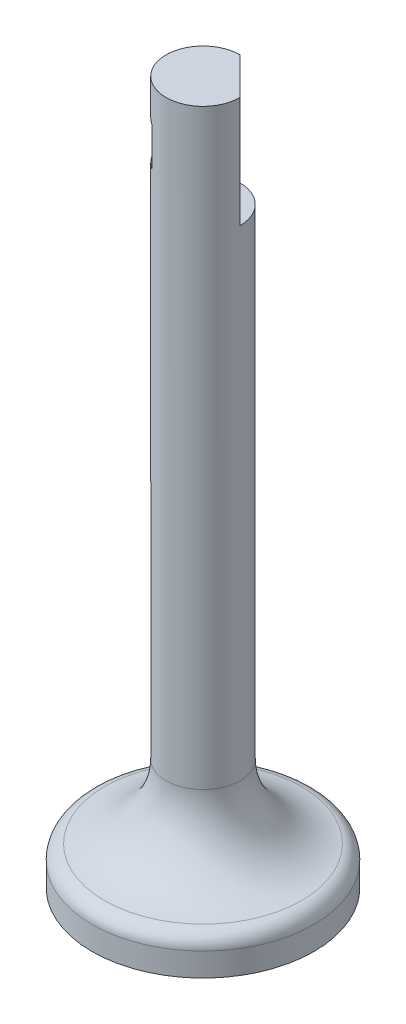
ISO-10303-21;
HEADER;
FILE_DESCRIPTION(('STEP AP214'),'2;1');
FILE_NAME('part.step','',(''),(''),'','','');
FILE_SCHEMA(('AUTOMOTIVE_DESIGN { 1 0 10303 214 1 1 1 1 }'));
ENDSEC;
DATA;
#1=APPLICATION_CONTEXT('core data for automotive mechanical design processes');
#2=APPLICATION_PROTOCOL_DEFINITION('international standard','automotive_design',2000,#1);
#3=PRODUCT_CONTEXT('',#1,'mechanical');
#4=PRODUCT('Part','Part','',(#3));
#5=PRODUCT_RELATED_PRODUCT_CATEGORY('part','',(#4));
#6=PRODUCT_DEFINITION_FORMATION('','',#4);
#7=PRODUCT_DEFINITION_CONTEXT('part definition',#1,'design');
#8=PRODUCT_DEFINITION('design','',#6,#7);
#9=PRODUCT_DEFINITION_SHAPE('','',#8);
#10=(LENGTH_UNIT() NAMED_UNIT(*) SI_UNIT(.MILLI.,.METRE.));
#11=(NAMED_UNIT(*) PLANE_ANGLE_UNIT() SI_UNIT($,.RADIAN.));
#12=(NAMED_UNIT(*) SI_UNIT($,.STERADIAN.) SOLID_ANGLE_UNIT());
#13=UNCERTAINTY_MEASURE_WITH_UNIT(LENGTH_MEASURE(1.E-05),#10,'distance_accuracy_value','');
#14=(GEOMETRIC_REPRESENTATION_CONTEXT(3) GLOBAL_UNCERTAINTY_ASSIGNED_CONTEXT((#13)) GLOBAL_UNIT_ASSIGNED_CONTEXT((#10,
#11,#12)) REPRESENTATION_CONTEXT('',''));
#15=CARTESIAN_POINT('',(0.,0.,0.));
#16=DIRECTION('',(0.,0.,1.));
#17=DIRECTION('',(1.,0.,0.));
#18=AXIS2_PLACEMENT_3D('',#15,#16,#17);
#19=CARTESIAN_POINT('',(0.,0.,0.));
#20=DIRECTION('',(0.,1.,0.));
#21=DIRECTION('',(0.,0.,1.));
#22=AXIS2_PLACEMENT_3D('',#19,#20,#21);
#23=PLANE('',#22);
#24=CARTESIAN_POINT('',(0.,0.,0.));
#25=DIRECTION('',(0.,-1.,0.));
#26=DIRECTION('',(0.,0.,-1.));
#27=AXIS2_PLACEMENT_3D('',#24,#25,#26);
#28=CIRCLE('',#27,13.5);
#29=CARTESIAN_POINT('',(0.,0.,-13.5));
#30=VERTEX_POINT('',#29);
#31=EDGE_CURVE('E206',#30,#30,#28,.T.);
#32=ORIENTED_EDGE('',*,*,#31,.F.);
#33=EDGE_LOOP('',(#32));
#34=FACE_BOUND('',#33,.T.);
#35=CARTESIAN_POINT('',(0.,0.,0.));
#36=DIRECTION('',(0.,1.,0.));
#37=DIRECTION('',(0.,0.,1.));
#38=AXIS2_PLACEMENT_3D('',#35,#36,#37);
#39=CIRCLE('',#38,15.);
#40=CARTESIAN_POINT('',(0.,0.,15.));
#41=VERTEX_POINT('',#40);
#42=EDGE_CURVE('E370',#41,#41,#39,.T.);
#43=ORIENTED_EDGE('',*,*,#42,.F.);
#44=EDGE_LOOP('',(#43));
#45=FACE_BOUND('',#44,.T.);
#46=ADVANCED_FACE('F34',(#34,#45),#23,.F.);
#47=CARTESIAN_POINT('',(0.,5.,0.));
#48=DIRECTION('',(0.,-1.,0.));
#49=DIRECTION('',(0.,0.,-1.));
#50=AXIS2_PLACEMENT_3D('',#47,#48,#49);
#51=CYLINDRICAL_SURFACE('',#50,15.);
#52=CARTESIAN_POINT('',(0.,3.16784043380077,0.));
#53=DIRECTION('',(0.,-1.,0.));
#54=DIRECTION('',(0.,0.,-1.));
#55=AXIS2_PLACEMENT_3D('',#52,#53,#54);
#56=CIRCLE('',#55,15.);
#57=CARTESIAN_POINT('',(0.,3.16784043380077,-15.));
#58=VERTEX_POINT('',#57);
#59=EDGE_CURVE('E11',#58,#58,#56,.T.);
#60=ORIENTED_EDGE('',*,*,#59,.T.);
#61=EDGE_LOOP('',(#60));
#62=FACE_BOUND('',#61,.T.);
#63=ORIENTED_EDGE('',*,*,#42,.T.);
#64=EDGE_LOOP('',(#63));
#65=FACE_BOUND('',#64,.T.);
#66=ADVANCED_FACE('F394',(#62,#65),#51,.T.);
#67=CARTESIAN_POINT('',(0.,95.,0.));
#68=DIRECTION('',(0.,-1.,0.));
#69=DIRECTION('',(0.,0.,-1.));
#70=AXIS2_PLACEMENT_3D('',#67,#68,#69);
#71=CYLINDRICAL_SURFACE('',#70,5.);
#72=CARTESIAN_POINT('',(0.,15.,0.));
#73=DIRECTION('',(0.,1.,0.));
#74=DIRECTION('',(0.,0.,1.));
#75=AXIS2_PLACEMENT_3D('',#72,#73,#74);
#76=CIRCLE('',#75,5.);
#77=CARTESIAN_POINT('',(0.,15.,5.));
#78=VERTEX_POINT('',#77);
#79=EDGE_CURVE('E373',#78,#78,#76,.T.);
#80=ORIENTED_EDGE('',*,*,#79,.T.);
#81=EDGE_LOOP('',(#80));
#82=FACE_BOUND('',#81,.T.);
#83=CARTESIAN_POINT('',(0.,90.1,0.));
#84=DIRECTION('',(0.,1.,0.));
#85=DIRECTION('',(0.,0.,1.));
#86=AXIS2_PLACEMENT_3D('',#83,#84,#85);
#87=CIRCLE('',#86,5.);
#88=CARTESIAN_POINT('',(-4.1712083963243,90.1,2.7569948339512));
#89=VERTEX_POINT('',#88);
#90=CARTESIAN_POINT('',(-2.75699483395121,90.1,4.1712083963243));
#91=VERTEX_POINT('',#90);
#92=EDGE_CURVE('E349',#89,#91,#87,.T.);
#93=ORIENTED_EDGE('',*,*,#92,.T.);
#94=DIRECTION('',(0.,-1.,0.));
#95=VECTOR('',#94,1.);
#96=CARTESIAN_POINT('',(-2.75699483395121,95.,4.1712083963243));
#97=LINE('',#96,#95);
#98=CARTESIAN_POINT('',(-2.75699483395121,84.9,4.1712083963243));
#99=VERTEX_POINT('',#98);
#100=EDGE_CURVE('E352',#91,#99,#97,.T.);
#101=ORIENTED_EDGE('',*,*,#100,.T.);
#102=CARTESIAN_POINT('',(0.,84.9,0.));
#103=DIRECTION('',(0.,-1.,0.));
#104=DIRECTION('',(0.,0.,-1.));
#105=AXIS2_PLACEMENT_3D('',#102,#103,#104);
#106=CIRCLE('',#105,5.);
#107=CARTESIAN_POINT('',(-4.1712083963243,84.9,2.75699483395121));
#108=VERTEX_POINT('',#107);
#109=EDGE_CURVE('E337',#99,#108,#106,.T.);
#110=ORIENTED_EDGE('',*,*,#109,.T.);
#111=DIRECTION('',(0.,-1.,0.));
#112=VECTOR('',#111,1.);
#113=CARTESIAN_POINT('',(-4.1712083963243,95.,2.75699483395121));
#114=LINE('',#113,#112);
#115=EDGE_CURVE('E346',#108,#89,#114,.F.);
#116=ORIENTED_EDGE('',*,*,#115,.T.);
#117=EDGE_LOOP('',(#93,#101,#110,#116));
#118=FACE_BOUND('',#117,.T.);
#119=CARTESIAN_POINT('',(0.,95.,0.));
#120=DIRECTION('',(0.,1.,0.));
#121=DIRECTION('',(0.,0.,1.));
#122=AXIS2_PLACEMENT_3D('',#119,#120,#121);
#123=CIRCLE('',#122,5.);
#124=CARTESIAN_POINT('',(0.,95.,-5.));
#125=VERTEX_POINT('',#124);
#126=CARTESIAN_POINT('',(5.,95.,0.));
#127=VERTEX_POINT('',#126);
#128=EDGE_CURVE('E366',#125,#127,#123,.T.);
#129=ORIENTED_EDGE('',*,*,#128,.F.);
#130=DIRECTION('',(0.,1.,0.));
#131=VECTOR('',#130,1.);
#132=CARTESIAN_POINT('',(0.,80.,-5.));
#133=LINE('',#132,#131);
#134=CARTESIAN_POINT('',(0.,80.,-5.));
#135=VERTEX_POINT('',#134);
#136=EDGE_CURVE('E361',#135,#125,#133,.T.);
#137=ORIENTED_EDGE('',*,*,#136,.F.);
#138=CARTESIAN_POINT('',(0.,80.,0.));
#139=DIRECTION('',(0.,1.,0.));
#140=DIRECTION('',(0.,0.,-1.));
#141=AXIS2_PLACEMENT_3D('',#138,#139,#140);
#142=CIRCLE('',#141,5.00000000000001);
#143=CARTESIAN_POINT('',(5.,80.,0.));
#144=VERTEX_POINT('',#143);
#145=EDGE_CURVE('E356',#144,#135,#142,.T.);
#146=ORIENTED_EDGE('',*,*,#145,.F.);
#147=DIRECTION('',(0.,1.,0.));
#148=VECTOR('',#147,1.);
#149=CARTESIAN_POINT('',(5.,80.,0.));
#150=LINE('',#149,#148);
#151=EDGE_CURVE('E363',#144,#127,#150,.T.);
#152=ORIENTED_EDGE('',*,*,#151,.T.);
#153=EDGE_LOOP('',(#129,#137,#146,#152));
#154=FACE_BOUND('',#153,.T.);
#155=ADVANCED_FACE('F401',(#82,#118,#154),#71,.T.);
#156=CARTESIAN_POINT('',(0.,95.,0.));
#157=DIRECTION('',(0.,1.,0.));
#158=DIRECTION('',(0.,0.,1.));
#159=AXIS2_PLACEMENT_3D('',#156,#157,#158);
#160=PLANE('',#159);
#161=DIRECTION('',(0.707106781186548,0.,0.707106781186548));
#162=VECTOR('',#161,1.);
#163=CARTESIAN_POINT('',(0.,95.,-5.));
#164=LINE('',#163,#162);
#165=EDGE_CURVE('E355',#125,#127,#164,.T.);
#166=ORIENTED_EDGE('',*,*,#165,.F.);
#167=ORIENTED_EDGE('',*,*,#128,.T.);
#168=EDGE_LOOP('',(#166,#167));
#169=FACE_BOUND('',#168,.T.);
#170=ADVANCED_FACE('F503',(#169),#160,.T.);
#171=CARTESIAN_POINT('',(0.,80.,-5.));
#172=DIRECTION('',(-0.707106781186547,0.,0.707106781186547));
#173=DIRECTION('',(0.707106781186548,0.,0.707106781186548));
#174=AXIS2_PLACEMENT_3D('',#171,#172,#173);
#175=PLANE('',#174);
#176=DIRECTION('',(-0.707106781186547,0.,-0.707106781186548));
#177=VECTOR('',#176,1.);
#178=CARTESIAN_POINT('',(1.79289321881345,84.9,-3.20710678118655));
#179=LINE('',#178,#177);
#180=CARTESIAN_POINT('',(3.20710678118655,84.9,-1.79289321881345));
#181=VERTEX_POINT('',#180);
#182=CARTESIAN_POINT('',(1.79289321881345,84.9,-3.20710678118655));
#183=VERTEX_POINT('',#182);
#184=EDGE_CURVE('E325',#181,#183,#179,.T.);
#185=ORIENTED_EDGE('',*,*,#184,.F.);
#186=DIRECTION('',(0.,-1.,0.));
#187=VECTOR('',#186,1.);
#188=CARTESIAN_POINT('',(3.20710678118655,90.1,-1.79289321881345));
#189=LINE('',#188,#187);
#190=CARTESIAN_POINT('',(3.20710678118655,90.1,-1.79289321881345));
#191=VERTEX_POINT('',#190);
#192=EDGE_CURVE('E323',#191,#181,#189,.T.);
#193=ORIENTED_EDGE('',*,*,#192,.F.);
#194=DIRECTION('',(0.707106781186547,0.,0.707106781186548));
#195=VECTOR('',#194,1.);
#196=CARTESIAN_POINT('',(1.79289321881345,90.1,-3.20710678118655));
#197=LINE('',#196,#195);
#198=CARTESIAN_POINT('',(1.79289321881345,90.1,-3.20710678118655));
#199=VERTEX_POINT('',#198);
#200=EDGE_CURVE('E331',#199,#191,#197,.T.);
#201=ORIENTED_EDGE('',*,*,#200,.F.);
#202=DIRECTION('',(0.,1.,0.));
#203=VECTOR('',#202,1.);
#204=CARTESIAN_POINT('',(1.79289321881345,90.1,-3.20710678118655));
#205=LINE('',#204,#203);
#206=EDGE_CURVE('E328',#183,#199,#205,.T.);
#207=ORIENTED_EDGE('',*,*,#206,.F.);
#208=EDGE_LOOP('',(#185,#193,#201,#207));
#209=FACE_BOUND('',#208,.T.);
#210=ORIENTED_EDGE('',*,*,#165,.T.);
#211=ORIENTED_EDGE('',*,*,#151,.F.);
#212=DIRECTION('',(0.707106781186548,0.,0.707106781186548));
#213=VECTOR('',#212,1.);
#214=CARTESIAN_POINT('',(0.,80.,-5.));
#215=LINE('',#214,#213);
#216=EDGE_CURVE('E358',#135,#144,#215,.T.);
#217=ORIENTED_EDGE('',*,*,#216,.F.);
#218=ORIENTED_EDGE('',*,*,#136,.T.);
#219=EDGE_LOOP('',(#210,#211,#217,#218));
#220=FACE_BOUND('',#219,.T.);
#221=ADVANCED_FACE('F499',(#209,#220),#175,.F.);
#222=CARTESIAN_POINT('',(0.,80.,0.));
#223=DIRECTION('',(0.,-1.,0.));
#224=DIRECTION('',(0.,0.,-1.));
#225=AXIS2_PLACEMENT_3D('',#222,#223,#224);
#226=PLANE('',#225);
#227=ORIENTED_EDGE('',*,*,#145,.T.);
#228=ORIENTED_EDGE('',*,*,#216,.T.);
#229=EDGE_LOOP('',(#227,#228));
#230=FACE_BOUND('',#229,.T.);
#231=ADVANCED_FACE('F495',(#230),#226,.F.);
#232=CARTESIAN_POINT('',(-14.2928932188135,90.1,15.7071067811865));
#233=DIRECTION('',(0.707106781186548,0.,0.707106781186548));
#234=DIRECTION('',(0.707106781186548,0.,-0.707106781186547));
#235=AXIS2_PLACEMENT_3D('',#232,#233,#234);
#236=PLANE('',#235);
#237=DIRECTION('',(0.707106781186548,0.,-0.707106781186548));
#238=VECTOR('',#237,1.);
#239=CARTESIAN_POINT('',(-14.2928932188135,90.1,15.7071067811865));
#240=LINE('',#239,#238);
#241=EDGE_CURVE('E335',#91,#191,#240,.T.);
#242=ORIENTED_EDGE('',*,*,#241,.T.);
#243=ORIENTED_EDGE('',*,*,#192,.T.);
#244=DIRECTION('',(0.707106781186548,0.,-0.707106781186548));
#245=VECTOR('',#244,1.);
#246=CARTESIAN_POINT('',(-14.2928932188135,84.9,15.7071067811865));
#247=LINE('',#246,#245);
#248=EDGE_CURVE('E334',#99,#181,#247,.T.);
#249=ORIENTED_EDGE('',*,*,#248,.F.);
#250=ORIENTED_EDGE('',*,*,#100,.F.);
#251=EDGE_LOOP('',(#242,#243,#249,#250));
#252=FACE_BOUND('',#251,.T.);
#253=ADVANCED_FACE('F485',(#252),#236,.F.);
#254=CARTESIAN_POINT('',(-15.7071067811866,90.1,14.2928932188135));
#255=DIRECTION('',(0.,1.,0.));
#256=DIRECTION('',(0.,0.,1.));
#257=AXIS2_PLACEMENT_3D('',#254,#255,#256);
#258=PLANE('',#257);
#259=DIRECTION('',(0.707106781186548,0.,-0.707106781186548));
#260=VECTOR('',#259,1.);
#261=CARTESIAN_POINT('',(-15.7071067811866,90.1,14.2928932188135));
#262=LINE('',#261,#260);
#263=EDGE_CURVE('E338',#89,#199,#262,.T.);
#264=ORIENTED_EDGE('',*,*,#263,.T.);
#265=ORIENTED_EDGE('',*,*,#200,.T.);
#266=ORIENTED_EDGE('',*,*,#241,.F.);
#267=ORIENTED_EDGE('',*,*,#92,.F.);
#268=EDGE_LOOP('',(#264,#265,#266,#267));
#269=FACE_BOUND('',#268,.T.);
#270=ADVANCED_FACE('F481',(#269),#258,.F.);
#271=CARTESIAN_POINT('',(-15.7071067811866,90.1,14.2928932188135));
#272=DIRECTION('',(-0.707106781186548,0.,-0.707106781186548));
#273=DIRECTION('',(-0.707106781186548,0.,0.707106781186547));
#274=AXIS2_PLACEMENT_3D('',#271,#272,#273);
#275=PLANE('',#274);
#276=DIRECTION('',(0.707106781186548,0.,-0.707106781186548));
#277=VECTOR('',#276,1.);
#278=CARTESIAN_POINT('',(-15.7071067811866,84.9,14.2928932188135));
#279=LINE('',#278,#277);
#280=EDGE_CURVE('E340',#108,#183,#279,.T.);
#281=ORIENTED_EDGE('',*,*,#280,.T.);
#282=ORIENTED_EDGE('',*,*,#206,.T.);
#283=ORIENTED_EDGE('',*,*,#263,.F.);
#284=ORIENTED_EDGE('',*,*,#115,.F.);
#285=EDGE_LOOP('',(#281,#282,#283,#284));
#286=FACE_BOUND('',#285,.T.);
#287=ADVANCED_FACE('F484',(#286),#275,.F.);
#288=CARTESIAN_POINT('',(-15.7071067811866,84.9,14.2928932188135));
#289=DIRECTION('',(0.,-1.,0.));
#290=DIRECTION('',(0.,0.,-1.));
#291=AXIS2_PLACEMENT_3D('',#288,#289,#290);
#292=PLANE('',#291);
#293=ORIENTED_EDGE('',*,*,#248,.T.);
#294=ORIENTED_EDGE('',*,*,#184,.T.);
#295=ORIENTED_EDGE('',*,*,#280,.F.);
#296=ORIENTED_EDGE('',*,*,#109,.F.);
#297=EDGE_LOOP('',(#293,#294,#295,#296));
#298=FACE_BOUND('',#297,.T.);
#299=ADVANCED_FACE('F391',(#298),#292,.F.);
#300=CARTESIAN_POINT('',(0.,15.,0.));
#301=DIRECTION('',(0.,1.,0.));
#302=DIRECTION('',(0.,0.,1.));
#303=AXIS2_PLACEMENT_3D('',#300,#301,#302);
#304=TOROIDAL_SURFACE('',#303,15.,10.);
#305=CARTESIAN_POINT('',(0.,5.13986702816722,0.));
#306=DIRECTION('',(0.,1.,0.));
#307=DIRECTION('',(0.,0.,1.));
#308=AXIS2_PLACEMENT_3D('',#305,#306,#307);
#309=CIRCLE('',#308,13.3333333333333);
#310=CARTESIAN_POINT('',(0.,5.13986702816722,13.3333333333333));
#311=VERTEX_POINT('',#310);
#312=EDGE_CURVE('E42',#311,#311,#309,.T.);
#313=ORIENTED_EDGE('',*,*,#312,.T.);
#314=EDGE_LOOP('',(#313));
#315=FACE_BOUND('',#314,.T.);
#316=ORIENTED_EDGE('',*,*,#79,.F.);
#317=EDGE_LOOP('',(#316));
#318=FACE_BOUND('',#317,.T.);
#319=ADVANCED_FACE('F378',(#315,#318),#304,.F.);
#320=CARTESIAN_POINT('',(0.,3.16784043380077,0.));
#321=DIRECTION('',(0.,-1.,0.));
#322=DIRECTION('',(0.,0.,-1.));
#323=AXIS2_PLACEMENT_3D('',#320,#321,#322);
#324=TOROIDAL_SURFACE('',#323,13.,2.);
#325=ORIENTED_EDGE('',*,*,#59,.F.);
#326=EDGE_LOOP('',(#325));
#327=FACE_BOUND('',#326,.T.);
#328=ORIENTED_EDGE('',*,*,#312,.F.);
#329=EDGE_LOOP('',(#328));
#330=FACE_BOUND('',#329,.T.);
#331=ADVANCED_FACE('F36',(#327,#330),#324,.T.);
#332=CARTESIAN_POINT('',(0.,1.,0.));
#333=DIRECTION('',(0.,-1.,0.));
#334=DIRECTION('',(0.,0.,-1.));
#335=AXIS2_PLACEMENT_3D('',#332,#333,#334);
#336=CYLINDRICAL_SURFACE('',#335,13.5);
#337=CARTESIAN_POINT('',(0.,1.,0.));
#338=DIRECTION('',(0.,-1.,0.));
#339=DIRECTION('',(0.,0.,-1.));
#340=AXIS2_PLACEMENT_3D('',#337,#338,#339);
#341=CIRCLE('',#340,13.5);
#342=CARTESIAN_POINT('',(0.,1.,-13.5));
#343=VERTEX_POINT('',#342);
#344=EDGE_CURVE('E421',#343,#343,#341,.T.);
#345=ORIENTED_EDGE('',*,*,#344,.F.);
#346=EDGE_LOOP('',(#345));
#347=FACE_BOUND('',#346,.T.);
#348=ORIENTED_EDGE('',*,*,#31,.T.);
#349=EDGE_LOOP('',(#348));
#350=FACE_BOUND('',#349,.T.);
#351=ADVANCED_FACE('F382',(#347,#350),#336,.F.);
#352=CARTESIAN_POINT('',(0.,1.,0.));
#353=DIRECTION('',(0.,-1.,0.));
#354=DIRECTION('',(0.,0.,-1.));
#355=AXIS2_PLACEMENT_3D('',#352,#353,#354);
#356=PLANE('',#355);
#357=CARTESIAN_POINT('',(0.,1.,0.));
#358=DIRECTION('',(0.,-1.,0.));
#359=DIRECTION('',(0.,0.,-1.));
#360=AXIS2_PLACEMENT_3D('',#357,#358,#359);
#361=CIRCLE('',#360,11.5);
#362=CARTESIAN_POINT('',(0.,1.,-11.5));
#363=VERTEX_POINT('',#362);
#364=EDGE_CURVE('E722',#363,#363,#361,.T.);
#365=ORIENTED_EDGE('',*,*,#364,.F.);
#366=EDGE_LOOP('',(#365));
#367=FACE_BOUND('',#366,.T.);
#368=ORIENTED_EDGE('',*,*,#344,.T.);
#369=EDGE_LOOP('',(#368));
#370=FACE_BOUND('',#369,.T.);
#371=ADVANCED_FACE('F388',(#367,#370),#356,.T.);
#372=CARTESIAN_POINT('',(0.,1.,0.));
#373=DIRECTION('',(0.,-1.,0.));
#374=DIRECTION('',(0.,0.,-1.));
#375=AXIS2_PLACEMENT_3D('',#372,#373,#374);
#376=CYLINDRICAL_SURFACE('',#375,11.5);
#377=ORIENTED_EDGE('',*,*,#364,.T.);
#378=EDGE_LOOP('',(#377));
#379=FACE_BOUND('',#378,.T.);
#380=CARTESIAN_POINT('',(0.,0.,0.));
#381=DIRECTION('',(0.,-1.,0.));
#382=DIRECTION('',(0.,0.,-1.));
#383=AXIS2_PLACEMENT_3D('',#380,#381,#382);
#384=CIRCLE('',#383,11.5);
#385=CARTESIAN_POINT('',(0.,0.,-11.5));
#386=VERTEX_POINT('',#385);
#387=EDGE_CURVE('E726',#386,#386,#384,.T.);
#388=ORIENTED_EDGE('',*,*,#387,.F.);
#389=EDGE_LOOP('',(#388));
#390=FACE_BOUND('',#389,.T.);
#391=ADVANCED_FACE('F411',(#379,#390),#376,.T.);
#392=DIRECTION('',(-0.707106781186547,0.,0.707106781186547));
#393=VECTOR('',#392,1.);
#394=CARTESIAN_POINT('',(6.7283189038852,0.,-1.64387003302747));
#395=LINE('',#394,#393);
#396=CARTESIAN_POINT('',(6.7283189038852,0.,-1.64387003302747));
#397=VERTEX_POINT('',#396);
#398=CARTESIAN_POINT('',(2.73793428850058,0.,2.34651458235714));
#399=VERTEX_POINT('',#398);
#400=EDGE_CURVE('E418',#397,#399,#395,.T.);
#401=ORIENTED_EDGE('',*,*,#400,.T.);
#402=DIRECTION('',(-0.707106781186547,0.,-0.707106781186547));
#403=VECTOR('',#402,1.);
#404=CARTESIAN_POINT('',(2.73793428850058,0.,2.34651458235714));
#405=LINE('',#404,#403);
#406=CARTESIAN_POINT('',(-0.1466810961148,0.,-0.538100802258242));
#407=VERTEX_POINT('',#406);
#408=EDGE_CURVE('E179',#399,#407,#405,.T.);
#409=ORIENTED_EDGE('',*,*,#408,.T.);
#410=CARTESIAN_POINT('',(-0.1466810961148,0.,-0.538100802258242));
#411=CARTESIAN_POINT('',(-0.260313381040353,0.,-0.654281270047645));
#412=CARTESIAN_POINT('',(-0.479959167902267,0.,-0.87885257284515));
#413=CARTESIAN_POINT('',(-0.773260090550031,0.,-1.22442088889786));
#414=CARTESIAN_POINT('',(-1.02708125579143,0.,-1.55905385316477));
#415=CARTESIAN_POINT('',(-1.23492163685,0.,-1.88554987427232));
#416=CARTESIAN_POINT('',(-1.40503337765702,0.,-2.20151633315848));
#417=CARTESIAN_POINT('',(-1.53200552415492,0.,-2.50925923637634));
#418=CARTESIAN_POINT('',(-1.61338180986301,0.,-2.80986865707557));
#419=CARTESIAN_POINT('',(-1.65318334289346,0.,-3.10201852880461));
#420=CARTESIAN_POINT('',(-1.6518259708436,0.,-3.38626179466907));
#421=CARTESIAN_POINT('',(-1.62027035623891,0.,-3.66383710708299));
#422=CARTESIAN_POINT('',(-1.55486640136559,0.,-3.93576491461758));
#423=CARTESIAN_POINT('',(-1.45863640347979,0.,-4.20262408613098));
#424=CARTESIAN_POINT('',(-1.32809101858191,0.,-4.46395990649645));
#425=CARTESIAN_POINT('',(-1.16776543244624,0.,-4.7217632457264));
#426=CARTESIAN_POINT('',(-0.97110420860823,0.,-4.97121055164106));
#427=CARTESIAN_POINT('',(-0.822117923174768,0.,-5.12794053084351));
#428=CARTESIAN_POINT('',(-0.746040070473775,0.,-5.20797259713004));
#429=B_SPLINE_CURVE_WITH_KNOTS('',3,(#410,#411,#412,#413,#414,#415,#416,#417,#418,#419,#420,
#421,#422,#423,#424,#425,#426,#427,#428),.UNSPECIFIED.,.F.,.F.,(4,1,1,1,1,1,1,1,1,1,1,1,1,1,1,1,
4),(0.,0.0903689686180256,0.174678906025784,0.251933054033876,0.32380936433784,
0.389737713133366,0.451314912353861,0.508543364637113,0.562500321348931,0.614795436923639,
0.666246368663659,0.71755984108315,0.770006678726507,0.823691330936171,0.879753959757821,
0.938597968861317,1.),.UNSPECIFIED.);
#430=CARTESIAN_POINT('',(-0.746040070473775,0.,-5.20797259713004));
#431=VERTEX_POINT('',#430);
#432=EDGE_CURVE('E57',#407,#431,#429,.T.);
#433=ORIENTED_EDGE('',*,*,#432,.T.);
#434=CARTESIAN_POINT('',(-0.746040070473775,0.,-5.20797259713004));
#435=CARTESIAN_POINT('',(-0.629335699997128,0.,-5.31630256621493));
#436=CARTESIAN_POINT('',(-0.402138795389844,0.,-5.52719641322143));
#437=CARTESIAN_POINT('',(-0.0192591634673007,0.,-5.7762508173502));
#438=CARTESIAN_POINT('',(0.382841414157794,0.,-5.95689026275365));
#439=CARTESIAN_POINT('',(0.800723527824096,0.,-6.06039970585505));
#440=CARTESIAN_POINT('',(1.2196986621587,0.,-6.10280381107347));
#441=CARTESIAN_POINT('',(1.63012575070082,0.,-6.06432865019671));
#442=CARTESIAN_POINT('',(2.02839093583842,0.,-5.96488044824835));
#443=CARTESIAN_POINT('',(2.27191715689669,0.,-5.84105954873388));
#444=CARTESIAN_POINT('',(2.39498557055187,0.,-5.77848541764286));
#445=B_SPLINE_CURVE_WITH_KNOTS('',3,(#434,#435,#436,#437,#438,#439,#440,#441,#442,#443,#444),
.UNSPECIFIED.,.F.,.F.,(4,1,1,1,1,1,1,1,4),(0.,0.138760373204217,0.270134932782644,
0.396614075853793,0.521669263641955,0.644323909714772,0.762252056625864,0.879851696816519,1.),.UNSPECIFIED.);
#446=CARTESIAN_POINT('',(2.39498557055187,0.,-5.77848541764286));
#447=VERTEX_POINT('',#446);
#448=EDGE_CURVE('E430',#431,#447,#445,.T.);
#449=ORIENTED_EDGE('',*,*,#448,.T.);
#450=CARTESIAN_POINT('',(2.39498557055187,0.,-5.77848541764286));
#451=CARTESIAN_POINT('',(2.43817035834486,0.,-5.75244687888495));
#452=CARTESIAN_POINT('',(2.53116458369093,0.,-5.69637542723068));
#453=CARTESIAN_POINT('',(2.67205045988086,0.,-5.59014107963945));
#454=CARTESIAN_POINT('',(2.83334386026455,0.,-5.46658650316883));
#455=CARTESIAN_POINT('',(3.00697528125703,0.,-5.31471726156727));
#456=CARTESIAN_POINT('',(3.20177143251085,0.,-5.14429358193024));
#457=CARTESIAN_POINT('',(3.41052933679114,0.,-4.9501050922304));
#458=CARTESIAN_POINT('',(3.63725670283621,0.,-4.7334162999663));
#459=CARTESIAN_POINT('',(3.79162296735506,0.,-4.58004457891199));
#460=CARTESIAN_POINT('',(3.87254967311597,0.,-4.4996392637967));
#461=B_SPLINE_CURVE_WITH_KNOTS('',3,(#450,#451,#452,#453,#454,#455,#456,#457,#458,#459,#460),
.UNSPECIFIED.,.F.,.F.,(4,1,1,1,1,1,1,1,4),(0.,0.0772094683417129,0.166263053838212,
0.270057135521959,0.388476414768502,0.519515450942809,0.666621521772866,0.825225919027062,1.),.UNSPECIFIED.);
#462=CARTESIAN_POINT('',(3.87254967311597,0.,-4.4996392637967));
#463=VERTEX_POINT('',#462);
#464=EDGE_CURVE('E203',#447,#463,#461,.T.);
#465=ORIENTED_EDGE('',*,*,#464,.T.);
#466=DIRECTION('',(0.707106781186547,0.,0.707106781186548));
#467=VECTOR('',#466,1.);
#468=CARTESIAN_POINT('',(3.87254967311597,0.,-4.4996392637967));
#469=LINE('',#468,#467);
#470=EDGE_CURVE('E200',#463,#397,#469,.T.);
#471=ORIENTED_EDGE('',*,*,#470,.T.);
#472=EDGE_LOOP('',(#401,#409,#433,#449,#465,#471));
#473=FACE_BOUND('',#472,.T.);
#474=ADVANCED_FACE('F232',(#473),#23,.F.);
#475=CARTESIAN_POINT('',(6.7283189038852,1.,-1.64387003302747));
#476=DIRECTION('',(0.707106781186548,0.,0.707106781186548));
#477=DIRECTION('',(0.707106781186547,0.,-0.707106781186548));
#478=AXIS2_PLACEMENT_3D('',#475,#476,#477);
#479=PLANE('',#478);
#480=ORIENTED_EDGE('',*,*,#400,.F.);
#481=DIRECTION('',(0.,-1.,0.));
#482=VECTOR('',#481,1.);
#483=CARTESIAN_POINT('',(6.7283189038852,1.,-1.64387003302747));
#484=LINE('',#483,#482);
#485=CARTESIAN_POINT('',(6.7283189038852,1.,-1.64387003302747));
#486=VERTEX_POINT('',#485);
#487=EDGE_CURVE('E199',#486,#397,#484,.T.);
#488=ORIENTED_EDGE('',*,*,#487,.F.);
#489=DIRECTION('',(-0.707106781186547,0.,0.707106781186547));
#490=VECTOR('',#489,1.);
#491=CARTESIAN_POINT('',(6.7283189038852,1.,-1.64387003302747));
#492=LINE('',#491,#490);
#493=CARTESIAN_POINT('',(2.73793428850058,1.,2.34651458235714));
#494=VERTEX_POINT('',#493);
#495=EDGE_CURVE('E192',#486,#494,#492,.T.);
#496=ORIENTED_EDGE('',*,*,#495,.T.);
#497=DIRECTION('',(0.,-1.,0.));
#498=VECTOR('',#497,1.);
#499=CARTESIAN_POINT('',(2.73793428850058,1.,2.34651458235714));
#500=LINE('',#499,#498);
#501=EDGE_CURVE('E174',#494,#399,#500,.T.);
#502=ORIENTED_EDGE('',*,*,#501,.T.);
#503=EDGE_LOOP('',(#480,#488,#496,#502));
#504=FACE_BOUND('',#503,.T.);
#505=ADVANCED_FACE('F198',(#504),#479,.T.);
#506=CARTESIAN_POINT('',(2.73793428850058,1.,2.34651458235714));
#507=DIRECTION('',(-0.707106781186547,0.,0.707106781186547));
#508=DIRECTION('',(0.707106781186548,0.,0.707106781186548));
#509=AXIS2_PLACEMENT_3D('',#506,#507,#508);
#510=PLANE('',#509);
#511=ORIENTED_EDGE('',*,*,#408,.F.);
#512=ORIENTED_EDGE('',*,*,#501,.F.);
#513=DIRECTION('',(-0.707106781186547,0.,-0.707106781186547));
#514=VECTOR('',#513,1.);
#515=CARTESIAN_POINT('',(2.73793428850058,1.,2.34651458235714));
#516=LINE('',#515,#514);
#517=CARTESIAN_POINT('',(-0.1466810961148,1.,-0.538100802258242));
#518=VERTEX_POINT('',#517);
#519=EDGE_CURVE('E177',#494,#518,#516,.T.);
#520=ORIENTED_EDGE('',*,*,#519,.T.);
#521=DIRECTION('',(0.,-1.,0.));
#522=VECTOR('',#521,1.);
#523=CARTESIAN_POINT('',(-0.1466810961148,1.,-0.538100802258242));
#524=LINE('',#523,#522);
#525=EDGE_CURVE('E184',#518,#407,#524,.T.);
#526=ORIENTED_EDGE('',*,*,#525,.T.);
#527=EDGE_LOOP('',(#511,#512,#520,#526));
#528=FACE_BOUND('',#527,.T.);
#529=ADVANCED_FACE('F176',(#528),#510,.T.);
#530=CARTESIAN_POINT('',(-0.1466810961148,1.,-0.538100802258242));
#531=CARTESIAN_POINT('',(-0.260313381040353,1.,-0.654281270047645));
#532=CARTESIAN_POINT('',(-0.479959167902267,1.,-0.87885257284515));
#533=CARTESIAN_POINT('',(-0.773260090550031,1.,-1.22442088889786));
#534=CARTESIAN_POINT('',(-1.02708125579143,1.,-1.55905385316477));
#535=CARTESIAN_POINT('',(-1.23492163685,1.,-1.88554987427232));
#536=CARTESIAN_POINT('',(-1.40503337765702,1.,-2.20151633315848));
#537=CARTESIAN_POINT('',(-1.53200552415492,1.,-2.50925923637634));
#538=CARTESIAN_POINT('',(-1.61338180986301,1.,-2.80986865707557));
#539=CARTESIAN_POINT('',(-1.65318334289346,1.,-3.10201852880461));
#540=CARTESIAN_POINT('',(-1.6518259708436,1.,-3.38626179466907));
#541=CARTESIAN_POINT('',(-1.62027035623891,1.,-3.66383710708299));
#542=CARTESIAN_POINT('',(-1.55486640136559,1.,-3.93576491461758));
#543=CARTESIAN_POINT('',(-1.45863640347979,1.,-4.20262408613098));
#544=CARTESIAN_POINT('',(-1.32809101858191,1.,-4.46395990649645));
#545=CARTESIAN_POINT('',(-1.16776543244624,1.,-4.7217632457264));
#546=CARTESIAN_POINT('',(-0.97110420860823,1.,-4.97121055164106));
#547=CARTESIAN_POINT('',(-0.822117923174768,1.,-5.12794053084351));
#548=CARTESIAN_POINT('',(-0.746040070473775,1.,-5.20797259713004));
#549=B_SPLINE_CURVE_WITH_KNOTS('',3,(#530,#531,#532,#533,#534,#535,#536,#537,#538,#539,#540,
#541,#542,#543,#544,#545,#546,#547,#548),.UNSPECIFIED.,.F.,.F.,(4,1,1,1,1,1,1,1,1,1,1,1,1,1,1,1,
4),(0.,0.0903689686180256,0.174678906025784,0.251933054033876,0.32380936433784,
0.389737713133366,0.451314912353861,0.508543364637113,0.562500321348931,0.614795436923639,
0.666246368663659,0.71755984108315,0.770006678726507,0.823691330936171,0.879753959757821,
0.938597968861317,1.),.UNSPECIFIED.);
#550=DIRECTION('',(0.,-1.,0.));
#551=VECTOR('',#550,1.);
#552=SURFACE_OF_LINEAR_EXTRUSION('',#549,#551);
#553=ORIENTED_EDGE('',*,*,#432,.F.);
#554=ORIENTED_EDGE('',*,*,#525,.F.);
#555=CARTESIAN_POINT('',(-0.746040070473775,1.,-5.20797259713004));
#556=VERTEX_POINT('',#555);
#557=EDGE_CURVE('E196',#518,#556,#549,.T.);
#558=ORIENTED_EDGE('',*,*,#557,.T.);
#559=DIRECTION('',(0.,-1.,0.));
#560=VECTOR('',#559,1.);
#561=CARTESIAN_POINT('',(-0.746040070473775,1.,-5.20797259713004));
#562=LINE('',#561,#560);
#563=EDGE_CURVE('E452',#556,#431,#562,.T.);
#564=ORIENTED_EDGE('',*,*,#563,.T.);
#565=EDGE_LOOP('',(#553,#554,#558,#564));
#566=FACE_BOUND('',#565,.T.);
#567=ADVANCED_FACE('F222',(#566),#552,.T.);
#568=CARTESIAN_POINT('',(-0.746040070473775,1.,-5.20797259713004));
#569=CARTESIAN_POINT('',(-0.629335699997128,1.,-5.31630256621493));
#570=CARTESIAN_POINT('',(-0.402138795389844,1.,-5.52719641322143));
#571=CARTESIAN_POINT('',(-0.0192591634673007,1.,-5.7762508173502));
#572=CARTESIAN_POINT('',(0.382841414157794,1.,-5.95689026275365));
#573=CARTESIAN_POINT('',(0.800723527824096,1.,-6.06039970585505));
#574=CARTESIAN_POINT('',(1.2196986621587,1.,-6.10280381107347));
#575=CARTESIAN_POINT('',(1.63012575070082,1.,-6.06432865019671));
#576=CARTESIAN_POINT('',(2.02839093583842,1.,-5.96488044824835));
#577=CARTESIAN_POINT('',(2.27191715689669,1.,-5.84105954873388));
#578=CARTESIAN_POINT('',(2.39498557055187,1.,-5.77848541764286));
#579=B_SPLINE_CURVE_WITH_KNOTS('',3,(#568,#569,#570,#571,#572,#573,#574,#575,#576,#577,#578),
.UNSPECIFIED.,.F.,.F.,(4,1,1,1,1,1,1,1,4),(0.,0.138760373204217,0.270134932782644,
0.396614075853793,0.521669263641955,0.644323909714772,0.762252056625864,0.879851696816519,1.),.UNSPECIFIED.);
#580=DIRECTION('',(0.,-1.,0.));
#581=VECTOR('',#580,1.);
#582=SURFACE_OF_LINEAR_EXTRUSION('',#579,#581);
#583=ORIENTED_EDGE('',*,*,#448,.F.);
#584=ORIENTED_EDGE('',*,*,#563,.F.);
#585=CARTESIAN_POINT('',(2.39498557055187,1.,-5.77848541764286));
#586=VERTEX_POINT('',#585);
#587=EDGE_CURVE('E213',#556,#586,#579,.T.);
#588=ORIENTED_EDGE('',*,*,#587,.T.);
#589=DIRECTION('',(0.,-1.,0.));
#590=VECTOR('',#589,1.);
#591=CARTESIAN_POINT('',(2.39498557055187,1.,-5.77848541764286));
#592=LINE('',#591,#590);
#593=EDGE_CURVE('E450',#586,#447,#592,.T.);
#594=ORIENTED_EDGE('',*,*,#593,.T.);
#595=EDGE_LOOP('',(#583,#584,#588,#594));
#596=FACE_BOUND('',#595,.T.);
#597=ADVANCED_FACE('F226',(#596),#582,.T.);
#598=CARTESIAN_POINT('',(2.39498557055187,1.,-5.77848541764286));
#599=CARTESIAN_POINT('',(2.43817035834486,1.,-5.75244687888495));
#600=CARTESIAN_POINT('',(2.53116458369093,1.,-5.69637542723068));
#601=CARTESIAN_POINT('',(2.67205045988086,1.,-5.59014107963945));
#602=CARTESIAN_POINT('',(2.83334386026455,1.,-5.46658650316883));
#603=CARTESIAN_POINT('',(3.00697528125703,1.,-5.31471726156727));
#604=CARTESIAN_POINT('',(3.20177143251085,1.,-5.14429358193024));
#605=CARTESIAN_POINT('',(3.41052933679114,1.,-4.9501050922304));
#606=CARTESIAN_POINT('',(3.63725670283621,1.,-4.7334162999663));
#607=CARTESIAN_POINT('',(3.79162296735506,1.,-4.58004457891199));
#608=CARTESIAN_POINT('',(3.87254967311597,1.,-4.4996392637967));
#609=B_SPLINE_CURVE_WITH_KNOTS('',3,(#598,#599,#600,#601,#602,#603,#604,#605,#606,#607,#608),
.UNSPECIFIED.,.F.,.F.,(4,1,1,1,1,1,1,1,4),(0.,0.0772094683417129,0.166263053838212,
0.270057135521959,0.388476414768502,0.519515450942809,0.666621521772866,0.825225919027062,1.),.UNSPECIFIED.);
#610=DIRECTION('',(0.,-1.,0.));
#611=VECTOR('',#610,1.);
#612=SURFACE_OF_LINEAR_EXTRUSION('',#609,#611);
#613=ORIENTED_EDGE('',*,*,#464,.F.);
#614=ORIENTED_EDGE('',*,*,#593,.F.);
#615=CARTESIAN_POINT('',(3.87254967311597,1.,-4.4996392637967));
#616=VERTEX_POINT('',#615);
#617=EDGE_CURVE('E709',#586,#616,#609,.T.);
#618=ORIENTED_EDGE('',*,*,#617,.T.);
#619=DIRECTION('',(0.,-1.,0.));
#620=VECTOR('',#619,1.);
#621=CARTESIAN_POINT('',(3.87254967311597,1.,-4.4996392637967));
#622=LINE('',#621,#620);
#623=EDGE_CURVE('E448',#616,#463,#622,.T.);
#624=ORIENTED_EDGE('',*,*,#623,.T.);
#625=EDGE_LOOP('',(#613,#614,#618,#624));
#626=FACE_BOUND('',#625,.T.);
#627=ADVANCED_FACE('F641',(#626),#612,.T.);
#628=CARTESIAN_POINT('',(3.87254967311597,1.,-4.4996392637967));
#629=DIRECTION('',(0.707106781186548,0.,-0.707106781186547));
#630=DIRECTION('',(-0.707106781186547,0.,-0.707106781186548));
#631=AXIS2_PLACEMENT_3D('',#628,#629,#630);
#632=PLANE('',#631);
#633=ORIENTED_EDGE('',*,*,#470,.F.);
#634=ORIENTED_EDGE('',*,*,#623,.F.);
#635=DIRECTION('',(0.707106781186547,0.,0.707106781186548));
#636=VECTOR('',#635,1.);
#637=CARTESIAN_POINT('',(3.87254967311597,1.,-4.4996392637967));
#638=LINE('',#637,#636);
#639=EDGE_CURVE('E185',#616,#486,#638,.T.);
#640=ORIENTED_EDGE('',*,*,#639,.T.);
#641=ORIENTED_EDGE('',*,*,#487,.T.);
#642=EDGE_LOOP('',(#633,#634,#640,#641));
#643=FACE_BOUND('',#642,.T.);
#644=ADVANCED_FACE('F236',(#643),#632,.T.);
#645=CARTESIAN_POINT('',(4.44306372950118,1.,-6.5267857602941));
#646=DIRECTION('',(0.,-1.,0.));
#647=DIRECTION('',(0.,0.,-1.));
#648=AXIS2_PLACEMENT_3D('',#645,#646,#647);
#649=PLANE('',#648);
#650=ORIENTED_EDGE('',*,*,#639,.F.);
#651=ORIENTED_EDGE('',*,*,#617,.F.);
#652=ORIENTED_EDGE('',*,*,#587,.F.);
#653=ORIENTED_EDGE('',*,*,#557,.F.);
#654=ORIENTED_EDGE('',*,*,#519,.F.);
#655=ORIENTED_EDGE('',*,*,#495,.F.);
#656=EDGE_LOOP('',(#650,#651,#652,#653,#654,#655));
#657=FACE_BOUND('',#656,.T.);
#658=DIRECTION('',(0.707106781186548,0.,0.707106781186547));
#659=VECTOR('',#658,1.);
#660=CARTESIAN_POINT('',(-3.11462981406352,1.,8.19907868492125));
#661=LINE('',#660,#659);
#662=CARTESIAN_POINT('',(-3.11462981406352,1.,8.19907868492125));
#663=VERTEX_POINT('',#662);
#664=CARTESIAN_POINT('',(-1.63706571149942,1.,9.67664278748535));
#665=VERTEX_POINT('',#664);
#666=EDGE_CURVE('E307',#663,#665,#661,.T.);
#667=ORIENTED_EDGE('',*,*,#666,.F.);
#668=DIRECTION('',(-0.707106781186547,0.,0.707106781186547));
#669=VECTOR('',#668,1.);
#670=CARTESIAN_POINT('',(1.42383172439802,1.,3.66061714645971));
#671=LINE('',#670,#669);
#672=CARTESIAN_POINT('',(1.42383172439802,1.,3.66061714645971));
#673=VERTEX_POINT('',#672);
#674=EDGE_CURVE('E267',#673,#663,#671,.T.);
#675=ORIENTED_EDGE('',*,*,#674,.F.);
#676=DIRECTION('',(0.707106781186548,0.,0.707106781186547));
#677=VECTOR('',#676,1.);
#678=CARTESIAN_POINT('',(-1.43834776278147,1.,0.79843765928022));
#679=LINE('',#678,#677);
#680=CARTESIAN_POINT('',(-1.43834776278147,1.,0.79843765928022));
#681=VERTEX_POINT('',#680);
#682=EDGE_CURVE('E257',#681,#673,#679,.T.);
#683=ORIENTED_EDGE('',*,*,#682,.F.);
#684=CARTESIAN_POINT('',(-2.22360417303788,1.,-6.77528028943773));
#685=CARTESIAN_POINT('',(-2.33673454202584,1.,-6.65635218449106));
#686=CARTESIAN_POINT('',(-2.56008706972146,1.,-6.42155322563048));
#687=CARTESIAN_POINT('',(-2.85577568395674,1.,-6.0428337269268));
#688=CARTESIAN_POINT('',(-3.10622798389908,1.,-5.64686053965336));
#689=CARTESIAN_POINT('',(-3.31599435807731,1.,-5.23830823686341));
#690=CARTESIAN_POINT('',(-3.48407364793237,1.,-4.8156334213579));
#691=CARTESIAN_POINT('',(-3.60974552315523,1.,-4.37756224491438));
#692=CARTESIAN_POINT('',(-3.69160005519557,1.,-3.92450076197329));
#693=CARTESIAN_POINT('',(-3.73783014630719,1.,-3.45679351872651));
#694=CARTESIAN_POINT('',(-3.71891559472614,1.,-2.97204674611859));
#695=CARTESIAN_POINT('',(-3.62400832046701,1.,-2.47179470675771));
#696=CARTESIAN_POINT('',(-3.44519628672031,1.,-1.96027219126566));
#697=CARTESIAN_POINT('',(-3.1958746334957,1.,-1.43194329243472));
#698=CARTESIAN_POINT('',(-2.86930840538284,1.,-0.889700641259926));
#699=CARTESIAN_POINT('',(-2.46423468125998,1.,-0.334885684021112));
#700=CARTESIAN_POINT('',(-1.98664420627844,1.,0.236940057109778));
#701=CARTESIAN_POINT('',(-1.62583511444217,1.,0.606436234424448));
#702=CARTESIAN_POINT('',(-1.43834776278147,1.,0.79843765928022));
#703=B_SPLINE_CURVE_WITH_KNOTS('',3,(#684,#685,#686,#687,#688,#689,#690,#691,#692,#693,#694,
#695,#696,#697,#698,#699,#700,#701,#702),.UNSPECIFIED.,.F.,.F.,(4,1,1,1,1,1,1,1,1,1,1,1,1,1,1,1,
4),(0.,0.0566198779026138,0.11178424467714,0.165481493374851,0.21808029787033,0.27004342427852,
0.322204973636797,0.375065423660911,0.428738619271346,0.484085022801101,0.541859848419526,
0.603768656168205,0.670565102130644,0.743151304772696,0.821840344764456,0.907422837482006,1.),.UNSPECIFIED.);
#704=CARTESIAN_POINT('',(-2.22360417303788,1.,-6.77528028943773));
#705=VERTEX_POINT('',#704);
#706=EDGE_CURVE('E252',#705,#681,#703,.T.);
#707=ORIENTED_EDGE('',*,*,#706,.F.);
#708=CARTESIAN_POINT('',(3.51037018593648,1.,-7.28489567405312));
#709=CARTESIAN_POINT('',(3.35205748831298,1.,-7.39165789329042));
#710=CARTESIAN_POINT('',(3.04588871947723,1.,-7.59813063813491));
#711=CARTESIAN_POINT('',(2.56645434673277,1.,-7.84861602944995));
#712=CARTESIAN_POINT('',(2.08870931504054,1.,-8.03160578855412));
#713=CARTESIAN_POINT('',(1.61155584635048,1.,-8.15504116241996));
#714=CARTESIAN_POINT('',(1.12909831087287,1.,-8.20605158377202));
#715=CARTESIAN_POINT('',(0.637891361455694,1.,-8.19210897478011));
#716=CARTESIAN_POINT('',(0.134888922649569,1.,-8.11428247981912));
#717=CARTESIAN_POINT('',(-0.372633355980091,1.,-7.96903076888754));
#718=CARTESIAN_POINT('',(-0.87260154578287,1.,-7.76308239596283));
#719=CARTESIAN_POINT('',(-1.35179785493428,1.,-7.49186203385631));
#720=CARTESIAN_POINT('',(-1.80946713613092,1.,-7.16716636821829));
#721=CARTESIAN_POINT('',(-2.08444581126626,1.,-6.90696188239909));
#722=CARTESIAN_POINT('',(-2.22360417303788,1.,-6.77528028943773));
#723=B_SPLINE_CURVE_WITH_KNOTS('',3,(#708,#709,#710,#711,#712,#713,#714,#715,#716,#717,#718,
#719,#720,#721,#722),.UNSPECIFIED.,.F.,.F.,(4,1,1,1,1,1,1,1,1,1,1,1,4),(0.,0.0904847921129284,
0.17499302213559,0.25580260952536,0.332587383197426,0.407993030773115,0.485014697220436,
0.564965585555384,0.648669937603116,0.734744033965219,0.820697314051418,0.909260352550704,1.),.UNSPECIFIED.);
#724=CARTESIAN_POINT('',(3.51037018593648,1.,-7.28489567405312));
#725=VERTEX_POINT('',#724);
#726=EDGE_CURVE('E258',#725,#705,#723,.T.);
#727=ORIENTED_EDGE('',*,*,#726,.F.);
#728=CARTESIAN_POINT('',(5.31165223721853,1.,-5.69515208430952));
#729=CARTESIAN_POINT('',(5.22213851403729,1.,-5.7840605941677));
#730=CARTESIAN_POINT('',(5.04738550964344,1.,-5.95763207194476));
#731=CARTESIAN_POINT('',(4.78998087935536,1.,-6.20563732687786));
#732=CARTESIAN_POINT('',(4.54517046377706,1.,-6.43414440635154));
#733=CARTESIAN_POINT('',(4.31465957249651,1.,-6.64409800614424));
#734=CARTESIAN_POINT('',(4.09362147956323,1.,-6.83092790564219));
#735=CARTESIAN_POINT('',(3.88975838170473,1.,-7.00271958924835));
#736=CARTESIAN_POINT('',(3.69565283041787,1.,-7.1502000353043));
#737=CARTESIAN_POINT('',(3.57034529277351,1.,-7.241295339294));
#738=CARTESIAN_POINT('',(3.51037018593648,1.,-7.28489567405312));
#739=B_SPLINE_CURVE_WITH_KNOTS('',3,(#728,#729,#730,#731,#732,#733,#734,#735,#736,#737,#738),
.UNSPECIFIED.,.F.,.F.,(4,1,1,1,1,1,1,1,4),(0.,0.15736079341875,0.307207324714292,
0.445800132137202,0.575058602324053,0.696035817320185,0.806766791007702,0.907514084374814,1.),.UNSPECIFIED.);
#740=CARTESIAN_POINT('',(5.31165223721853,1.,-5.69515208430952));
#741=VERTEX_POINT('',#740);
#742=EDGE_CURVE('E460',#741,#725,#739,.T.);
#743=ORIENTED_EDGE('',*,*,#742,.F.);
#744=DIRECTION('',(-0.707106781186548,0.,-0.707106781186547));
#745=VECTOR('',#744,1.);
#746=CARTESIAN_POINT('',(9.52319069875699,1.,-1.48361362277106));
#747=LINE('',#746,#745);
#748=CARTESIAN_POINT('',(9.52319069875699,1.,-1.48361362277106));
#749=VERTEX_POINT('',#748);
#750=EDGE_CURVE('E459',#749,#741,#747,.T.);
#751=ORIENTED_EDGE('',*,*,#750,.F.);
#752=DIRECTION('',(0.707106781186548,0.,-0.707106781186547));
#753=VECTOR('',#752,1.);
#754=CARTESIAN_POINT('',(-1.63706571149942,1.,9.67664278748535));
#755=LINE('',#754,#753);
#756=EDGE_CURVE('E457',#665,#749,#755,.T.);
#757=ORIENTED_EDGE('',*,*,#756,.F.);
#758=EDGE_LOOP('',(#667,#675,#683,#707,#727,#743,#751,#757));
#759=FACE_BOUND('',#758,.T.);
#760=ADVANCED_FACE('F190',(#657,#759),#649,.T.);
#761=CARTESIAN_POINT('',(1.42383172439802,1.,3.66061714645971));
#762=DIRECTION('',(0.707106781186547,0.,0.707106781186547));
#763=DIRECTION('',(0.707106781186548,0.,-0.707106781186548));
#764=AXIS2_PLACEMENT_3D('',#761,#762,#763);
#765=PLANE('',#764);
#766=DIRECTION('',(-0.707106781186547,0.,0.707106781186547));
#767=VECTOR('',#766,1.);
#768=CARTESIAN_POINT('',(1.42383172439802,0.,3.66061714645971));
#769=LINE('',#768,#767);
#770=CARTESIAN_POINT('',(1.42383172439802,0.,3.66061714645971));
#771=VERTEX_POINT('',#770);
#772=CARTESIAN_POINT('',(-3.11462981406352,0.,8.19907868492125));
#773=VERTEX_POINT('',#772);
#774=EDGE_CURVE('E304',#771,#773,#769,.T.);
#775=ORIENTED_EDGE('',*,*,#774,.F.);
#776=DIRECTION('',(0.,-1.,0.));
#777=VECTOR('',#776,1.);
#778=CARTESIAN_POINT('',(1.42383172439802,1.,3.66061714645971));
#779=LINE('',#778,#777);
#780=EDGE_CURVE('E309',#673,#771,#779,.T.);
#781=ORIENTED_EDGE('',*,*,#780,.F.);
#782=ORIENTED_EDGE('',*,*,#674,.T.);
#783=DIRECTION('',(0.,-1.,0.));
#784=VECTOR('',#783,1.);
#785=CARTESIAN_POINT('',(-3.11462981406352,1.,8.19907868492125));
#786=LINE('',#785,#784);
#787=EDGE_CURVE('E269',#663,#773,#786,.T.);
#788=ORIENTED_EDGE('',*,*,#787,.T.);
#789=EDGE_LOOP('',(#775,#781,#782,#788));
#790=FACE_BOUND('',#789,.T.);
#791=ADVANCED_FACE('F235',(#790),#765,.T.);
#792=CARTESIAN_POINT('',(-1.43834776278147,1.,0.79843765928022));
#793=DIRECTION('',(0.707106781186547,0.,-0.707106781186548));
#794=DIRECTION('',(-0.707106781186548,0.,-0.707106781186547));
#795=AXIS2_PLACEMENT_3D('',#792,#793,#794);
#796=PLANE('',#795);
#797=DIRECTION('',(0.707106781186548,0.,0.707106781186547));
#798=VECTOR('',#797,1.);
#799=CARTESIAN_POINT('',(-1.43834776278147,0.,0.79843765928022));
#800=LINE('',#799,#798);
#801=CARTESIAN_POINT('',(-1.43834776278147,0.,0.79843765928022));
#802=VERTEX_POINT('',#801);
#803=EDGE_CURVE('E298',#802,#771,#800,.T.);
#804=ORIENTED_EDGE('',*,*,#803,.F.);
#805=DIRECTION('',(0.,-1.,0.));
#806=VECTOR('',#805,1.);
#807=CARTESIAN_POINT('',(-1.43834776278147,1.,0.79843765928022));
#808=LINE('',#807,#806);
#809=EDGE_CURVE('E311',#681,#802,#808,.T.);
#810=ORIENTED_EDGE('',*,*,#809,.F.);
#811=ORIENTED_EDGE('',*,*,#682,.T.);
#812=ORIENTED_EDGE('',*,*,#780,.T.);
#813=EDGE_LOOP('',(#804,#810,#811,#812));
#814=FACE_BOUND('',#813,.T.);
#815=ADVANCED_FACE('F239',(#814),#796,.T.);
#816=DIRECTION('',(0.,-1.,0.));
#817=VECTOR('',#816,1.);
#818=SURFACE_OF_LINEAR_EXTRUSION('',#703,#817);
#819=CARTESIAN_POINT('',(-2.22360417303788,0.,-6.77528028943773));
#820=CARTESIAN_POINT('',(-2.33673454202584,0.,-6.65635218449106));
#821=CARTESIAN_POINT('',(-2.56008706972146,0.,-6.42155322563048));
#822=CARTESIAN_POINT('',(-2.85577568395674,0.,-6.0428337269268));
#823=CARTESIAN_POINT('',(-3.10622798389908,0.,-5.64686053965336));
#824=CARTESIAN_POINT('',(-3.31599435807731,0.,-5.23830823686341));
#825=CARTESIAN_POINT('',(-3.48407364793237,0.,-4.8156334213579));
#826=CARTESIAN_POINT('',(-3.60974552315523,0.,-4.37756224491438));
#827=CARTESIAN_POINT('',(-3.69160005519557,0.,-3.92450076197329));
#828=CARTESIAN_POINT('',(-3.73783014630719,0.,-3.45679351872651));
#829=CARTESIAN_POINT('',(-3.71891559472614,0.,-2.97204674611859));
#830=CARTESIAN_POINT('',(-3.62400832046701,0.,-2.47179470675771));
#831=CARTESIAN_POINT('',(-3.44519628672031,0.,-1.96027219126566));
#832=CARTESIAN_POINT('',(-3.1958746334957,0.,-1.43194329243472));
#833=CARTESIAN_POINT('',(-2.86930840538284,0.,-0.889700641259926));
#834=CARTESIAN_POINT('',(-2.46423468125998,0.,-0.334885684021112));
#835=CARTESIAN_POINT('',(-1.98664420627844,0.,0.236940057109778));
#836=CARTESIAN_POINT('',(-1.62583511444217,0.,0.606436234424448));
#837=CARTESIAN_POINT('',(-1.43834776278147,0.,0.79843765928022));
#838=B_SPLINE_CURVE_WITH_KNOTS('',3,(#819,#820,#821,#822,#823,#824,#825,#826,#827,#828,#829,
#830,#831,#832,#833,#834,#835,#836,#837),.UNSPECIFIED.,.F.,.F.,(4,1,1,1,1,1,1,1,1,1,1,1,1,1,1,1,
4),(0.,0.0566198779026138,0.11178424467714,0.165481493374851,0.21808029787033,0.27004342427852,
0.322204973636797,0.375065423660911,0.428738619271346,0.484085022801101,0.541859848419526,
0.603768656168205,0.670565102130644,0.743151304772696,0.821840344764456,0.907422837482006,1.),.UNSPECIFIED.);
#839=CARTESIAN_POINT('',(-2.22360417303788,0.,-6.77528028943773));
#840=VERTEX_POINT('',#839);
#841=EDGE_CURVE('E290',#840,#802,#838,.T.);
#842=ORIENTED_EDGE('',*,*,#841,.F.);
#843=DIRECTION('',(0.,-1.,0.));
#844=VECTOR('',#843,1.);
#845=CARTESIAN_POINT('',(-2.22360417303788,1.,-6.77528028943773));
#846=LINE('',#845,#844);
#847=EDGE_CURVE('E313',#705,#840,#846,.T.);
#848=ORIENTED_EDGE('',*,*,#847,.F.);
#849=ORIENTED_EDGE('',*,*,#706,.T.);
#850=ORIENTED_EDGE('',*,*,#809,.T.);
#851=EDGE_LOOP('',(#842,#848,#849,#850));
#852=FACE_BOUND('',#851,.T.);
#853=ADVANCED_FACE('F243',(#852),#818,.T.);
#854=DIRECTION('',(0.,-1.,0.));
#855=VECTOR('',#854,1.);
#856=SURFACE_OF_LINEAR_EXTRUSION('',#723,#855);
#857=CARTESIAN_POINT('',(3.51037018593648,0.,-7.28489567405312));
#858=CARTESIAN_POINT('',(3.35205748831298,0.,-7.39165789329042));
#859=CARTESIAN_POINT('',(3.04588871947723,0.,-7.59813063813491));
#860=CARTESIAN_POINT('',(2.56645434673277,0.,-7.84861602944995));
#861=CARTESIAN_POINT('',(2.08870931504054,0.,-8.03160578855412));
#862=CARTESIAN_POINT('',(1.61155584635048,0.,-8.15504116241996));
#863=CARTESIAN_POINT('',(1.12909831087287,0.,-8.20605158377202));
#864=CARTESIAN_POINT('',(0.637891361455694,0.,-8.19210897478011));
#865=CARTESIAN_POINT('',(0.134888922649569,0.,-8.11428247981912));
#866=CARTESIAN_POINT('',(-0.372633355980091,0.,-7.96903076888754));
#867=CARTESIAN_POINT('',(-0.87260154578287,0.,-7.76308239596283));
#868=CARTESIAN_POINT('',(-1.35179785493428,0.,-7.49186203385631));
#869=CARTESIAN_POINT('',(-1.80946713613092,0.,-7.16716636821829));
#870=CARTESIAN_POINT('',(-2.08444581126626,0.,-6.90696188239909));
#871=CARTESIAN_POINT('',(-2.22360417303788,0.,-6.77528028943773));
#872=B_SPLINE_CURVE_WITH_KNOTS('',3,(#857,#858,#859,#860,#861,#862,#863,#864,#865,#866,#867,
#868,#869,#870,#871),.UNSPECIFIED.,.F.,.F.,(4,1,1,1,1,1,1,1,1,1,1,1,4),(0.,0.0904847921129284,
0.17499302213559,0.25580260952536,0.332587383197426,0.407993030773115,0.485014697220436,
0.564965585555384,0.648669937603116,0.734744033965219,0.820697314051418,0.909260352550704,1.),.UNSPECIFIED.);
#873=CARTESIAN_POINT('',(3.51037018593648,0.,-7.28489567405312));
#874=VERTEX_POINT('',#873);
#875=EDGE_CURVE('E282',#874,#840,#872,.T.);
#876=ORIENTED_EDGE('',*,*,#875,.F.);
#877=DIRECTION('',(0.,-1.,0.));
#878=VECTOR('',#877,1.);
#879=CARTESIAN_POINT('',(3.51037018593648,1.,-7.28489567405312));
#880=LINE('',#879,#878);
#881=EDGE_CURVE('E315',#725,#874,#880,.T.);
#882=ORIENTED_EDGE('',*,*,#881,.F.);
#883=ORIENTED_EDGE('',*,*,#726,.T.);
#884=ORIENTED_EDGE('',*,*,#847,.T.);
#885=EDGE_LOOP('',(#876,#882,#883,#884));
#886=FACE_BOUND('',#885,.T.);
#887=ADVANCED_FACE('F248',(#886),#856,.T.);
#888=DIRECTION('',(0.,-1.,0.));
#889=VECTOR('',#888,1.);
#890=SURFACE_OF_LINEAR_EXTRUSION('',#739,#889);
#891=CARTESIAN_POINT('',(5.31165223721853,0.,-5.69515208430952));
#892=CARTESIAN_POINT('',(5.22213851403729,0.,-5.7840605941677));
#893=CARTESIAN_POINT('',(5.04738550964344,0.,-5.95763207194476));
#894=CARTESIAN_POINT('',(4.78998087935536,0.,-6.20563732687786));
#895=CARTESIAN_POINT('',(4.54517046377706,0.,-6.43414440635154));
#896=CARTESIAN_POINT('',(4.31465957249651,0.,-6.64409800614424));
#897=CARTESIAN_POINT('',(4.09362147956323,0.,-6.83092790564219));
#898=CARTESIAN_POINT('',(3.88975838170473,0.,-7.00271958924835));
#899=CARTESIAN_POINT('',(3.69565283041787,0.,-7.1502000353043));
#900=CARTESIAN_POINT('',(3.57034529277351,0.,-7.241295339294));
#901=CARTESIAN_POINT('',(3.51037018593648,0.,-7.28489567405312));
#902=B_SPLINE_CURVE_WITH_KNOTS('',3,(#891,#892,#893,#894,#895,#896,#897,#898,#899,#900,#901),
.UNSPECIFIED.,.F.,.F.,(4,1,1,1,1,1,1,1,4),(0.,0.15736079341875,0.307207324714292,
0.445800132137202,0.575058602324053,0.696035817320185,0.806766791007702,0.907514084374814,1.),.UNSPECIFIED.);
#903=CARTESIAN_POINT('',(5.31165223721853,0.,-5.69515208430952));
#904=VERTEX_POINT('',#903);
#905=EDGE_CURVE('E277',#904,#874,#902,.T.);
#906=ORIENTED_EDGE('',*,*,#905,.F.);
#907=DIRECTION('',(0.,-1.,0.));
#908=VECTOR('',#907,1.);
#909=CARTESIAN_POINT('',(5.31165223721853,1.,-5.69515208430952));
#910=LINE('',#909,#908);
#911=EDGE_CURVE('E317',#741,#904,#910,.T.);
#912=ORIENTED_EDGE('',*,*,#911,.F.);
#913=ORIENTED_EDGE('',*,*,#742,.T.);
#914=ORIENTED_EDGE('',*,*,#881,.T.);
#915=EDGE_LOOP('',(#906,#912,#913,#914));
#916=FACE_BOUND('',#915,.T.);
#917=ADVANCED_FACE('F467',(#916),#890,.T.);
#918=CARTESIAN_POINT('',(9.52319069875699,1.,-1.48361362277106));
#919=DIRECTION('',(-0.707106781186547,0.,0.707106781186548));
#920=DIRECTION('',(0.707106781186548,0.,0.707106781186547));
#921=AXIS2_PLACEMENT_3D('',#918,#919,#920);
#922=PLANE('',#921);
#923=DIRECTION('',(-0.707106781186548,0.,-0.707106781186547));
#924=VECTOR('',#923,1.);
#925=CARTESIAN_POINT('',(9.52319069875699,0.,-1.48361362277106));
#926=LINE('',#925,#924);
#927=CARTESIAN_POINT('',(9.52319069875699,0.,-1.48361362277106));
#928=VERTEX_POINT('',#927);
#929=EDGE_CURVE('E274',#928,#904,#926,.T.);
#930=ORIENTED_EDGE('',*,*,#929,.F.);
#931=DIRECTION('',(0.,-1.,0.));
#932=VECTOR('',#931,1.);
#933=CARTESIAN_POINT('',(9.52319069875699,1.,-1.48361362277106));
#934=LINE('',#933,#932);
#935=EDGE_CURVE('E319',#749,#928,#934,.T.);
#936=ORIENTED_EDGE('',*,*,#935,.F.);
#937=ORIENTED_EDGE('',*,*,#750,.T.);
#938=ORIENTED_EDGE('',*,*,#911,.T.);
#939=EDGE_LOOP('',(#930,#936,#937,#938));
#940=FACE_BOUND('',#939,.T.);
#941=ADVANCED_FACE('F470',(#940),#922,.T.);
#942=CARTESIAN_POINT('',(-1.63706571149942,1.,9.67664278748535));
#943=DIRECTION('',(-0.707106781186547,0.,-0.707106781186548));
#944=DIRECTION('',(-0.707106781186548,0.,0.707106781186547));
#945=AXIS2_PLACEMENT_3D('',#942,#943,#944);
#946=PLANE('',#945);
#947=DIRECTION('',(0.707106781186548,0.,-0.707106781186547));
#948=VECTOR('',#947,1.);
#949=CARTESIAN_POINT('',(-1.63706571149942,0.,9.67664278748535));
#950=LINE('',#949,#948);
#951=CARTESIAN_POINT('',(-1.63706571149942,0.,9.67664278748535));
#952=VERTEX_POINT('',#951);
#953=EDGE_CURVE('E271',#952,#928,#950,.T.);
#954=ORIENTED_EDGE('',*,*,#953,.F.);
#955=DIRECTION('',(0.,-1.,0.));
#956=VECTOR('',#955,1.);
#957=CARTESIAN_POINT('',(-1.63706571149942,1.,9.67664278748535));
#958=LINE('',#957,#956);
#959=EDGE_CURVE('E321',#665,#952,#958,.T.);
#960=ORIENTED_EDGE('',*,*,#959,.F.);
#961=ORIENTED_EDGE('',*,*,#756,.T.);
#962=ORIENTED_EDGE('',*,*,#935,.T.);
#963=EDGE_LOOP('',(#954,#960,#961,#962));
#964=FACE_BOUND('',#963,.T.);
#965=ADVANCED_FACE('F474',(#964),#946,.T.);
#966=CARTESIAN_POINT('',(-3.11462981406352,1.,8.19907868492125));
#967=DIRECTION('',(0.707106781186547,0.,-0.707106781186548));
#968=DIRECTION('',(-0.707106781186548,0.,-0.707106781186547));
#969=AXIS2_PLACEMENT_3D('',#966,#967,#968);
#970=PLANE('',#969);
#971=DIRECTION('',(0.707106781186548,0.,0.707106781186547));
#972=VECTOR('',#971,1.);
#973=CARTESIAN_POINT('',(-3.11462981406352,0.,8.19907868492125));
#974=LINE('',#973,#972);
#975=EDGE_CURVE('E49',#773,#952,#974,.T.);
#976=ORIENTED_EDGE('',*,*,#975,.F.);
#977=ORIENTED_EDGE('',*,*,#787,.F.);
#978=ORIENTED_EDGE('',*,*,#666,.T.);
#979=ORIENTED_EDGE('',*,*,#959,.T.);
#980=EDGE_LOOP('',(#976,#977,#978,#979));
#981=FACE_BOUND('',#980,.T.);
#982=ADVANCED_FACE('F408',(#981),#970,.T.);
#983=ORIENTED_EDGE('',*,*,#975,.T.);
#984=ORIENTED_EDGE('',*,*,#953,.T.);
#985=ORIENTED_EDGE('',*,*,#929,.T.);
#986=ORIENTED_EDGE('',*,*,#905,.T.);
#987=ORIENTED_EDGE('',*,*,#875,.T.);
#988=ORIENTED_EDGE('',*,*,#841,.T.);
#989=ORIENTED_EDGE('',*,*,#803,.T.);
#990=ORIENTED_EDGE('',*,*,#774,.T.);
#991=EDGE_LOOP('',(#983,#984,#985,#986,#987,#988,#989,#990));
#992=FACE_BOUND('',#991,.T.);
#993=ORIENTED_EDGE('',*,*,#387,.T.);
#994=EDGE_LOOP('',(#993));
#995=FACE_BOUND('',#994,.T.);
#996=ADVANCED_FACE('F397',(#992,#995),#23,.F.);
#997=CLOSED_SHELL('',(#46,#66,#155,#170,#221,#231,#253,#270,#287,#299,#319,#331,#351,#371,#391,
#474,#505,#529,#567,#597,#627,#644,#760,#791,#815,#853,#887,#917,#941,#965,#982,#996));
#998=MANIFOLD_SOLID_BREP('B2',#997);
#999=ADVANCED_BREP_SHAPE_REPRESENTATION('',(#18,#998),#14);
#1000=SHAPE_DEFINITION_REPRESENTATION(#9,#999);
ENDSEC;
END-ISO-10303-21;
